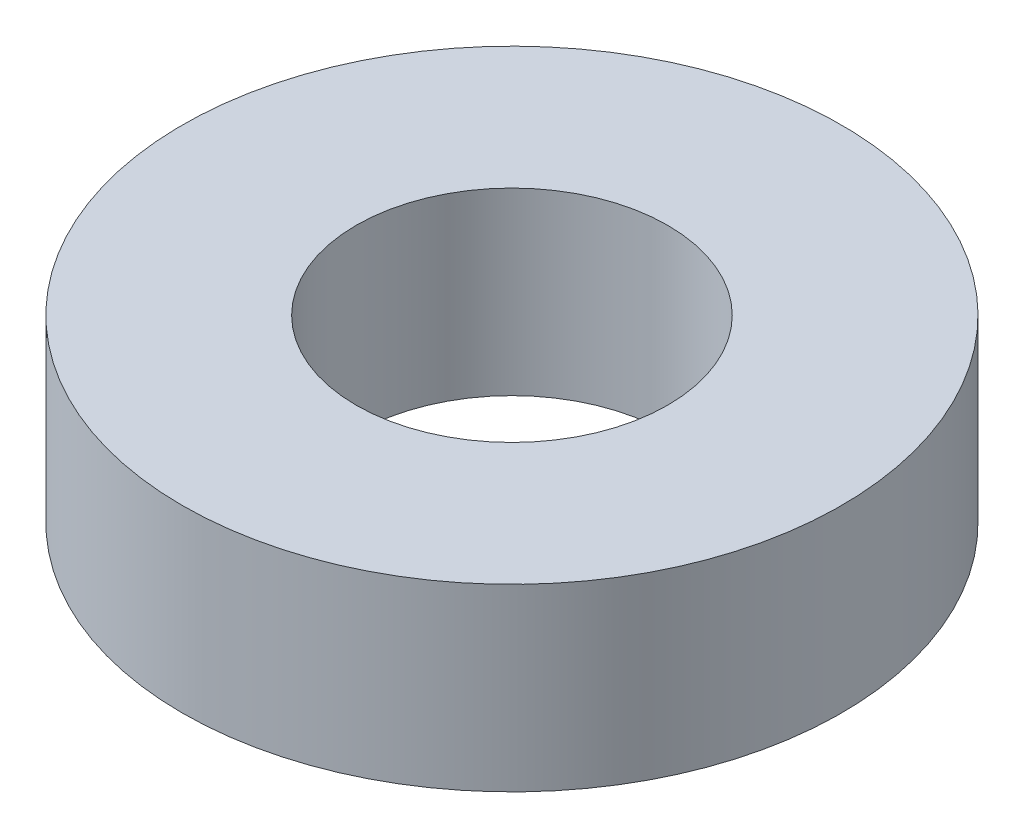
ISO-10303-21;
HEADER;
FILE_DESCRIPTION(('STEP AP214'),'2;1');
FILE_NAME('part.step','',(''),(''),'','','');
FILE_SCHEMA(('AUTOMOTIVE_DESIGN { 1 0 10303 214 1 1 1 1 }'));
ENDSEC;
DATA;
#1=APPLICATION_CONTEXT('core data for automotive mechanical design processes');
#2=APPLICATION_PROTOCOL_DEFINITION('international standard','automotive_design',2000,#1);
#3=PRODUCT_CONTEXT('',#1,'mechanical');
#4=PRODUCT('Part','Part','',(#3));
#5=PRODUCT_RELATED_PRODUCT_CATEGORY('part','',(#4));
#6=PRODUCT_DEFINITION_FORMATION('','',#4);
#7=PRODUCT_DEFINITION_CONTEXT('part definition',#1,'design');
#8=PRODUCT_DEFINITION('design','',#6,#7);
#9=PRODUCT_DEFINITION_SHAPE('','',#8);
#10=(LENGTH_UNIT() NAMED_UNIT(*) SI_UNIT(.MILLI.,.METRE.));
#11=(NAMED_UNIT(*) PLANE_ANGLE_UNIT() SI_UNIT($,.RADIAN.));
#12=(NAMED_UNIT(*) SI_UNIT($,.STERADIAN.) SOLID_ANGLE_UNIT());
#13=UNCERTAINTY_MEASURE_WITH_UNIT(LENGTH_MEASURE(1.E-05),#10,'distance_accuracy_value','');
#14=(GEOMETRIC_REPRESENTATION_CONTEXT(3) GLOBAL_UNCERTAINTY_ASSIGNED_CONTEXT((#13)) GLOBAL_UNIT_ASSIGNED_CONTEXT((#10,
#11,#12)) REPRESENTATION_CONTEXT('',''));
#15=CARTESIAN_POINT('',(0.,0.,0.));
#16=DIRECTION('',(0.,0.,1.));
#17=DIRECTION('',(1.,0.,0.));
#18=AXIS2_PLACEMENT_3D('',#15,#16,#17);
#19=CARTESIAN_POINT('',(0.,15.,0.));
#20=DIRECTION('',(0.,1.,0.));
#21=DIRECTION('',(0.,0.,1.));
#22=AXIS2_PLACEMENT_3D('',#19,#20,#21);
#23=PLANE('',#22);
#24=CARTESIAN_POINT('',(0.,15.,0.));
#25=DIRECTION('',(0.,1.,0.));
#26=DIRECTION('',(0.,0.,1.));
#27=AXIS2_PLACEMENT_3D('',#24,#25,#26);
#28=CIRCLE('',#27,27.5);
#29=CARTESIAN_POINT('',(0.,15.,27.5));
#30=VERTEX_POINT('',#29);
#31=EDGE_CURVE('E10',#30,#30,#28,.T.);
#32=ORIENTED_EDGE('',*,*,#31,.T.);
#33=EDGE_LOOP('',(#32));
#34=FACE_BOUND('',#33,.T.);
#35=CARTESIAN_POINT('',(0.,15.,0.));
#36=DIRECTION('',(0.,1.,0.));
#37=DIRECTION('',(0.,0.,1.));
#38=AXIS2_PLACEMENT_3D('',#35,#36,#37);
#39=CIRCLE('',#38,13.);
#40=CARTESIAN_POINT('',(0.,15.,13.));
#41=VERTEX_POINT('',#40);
#42=EDGE_CURVE('E26',#41,#41,#39,.T.);
#43=ORIENTED_EDGE('',*,*,#42,.F.);
#44=EDGE_LOOP('',(#43));
#45=FACE_BOUND('',#44,.T.);
#46=ADVANCED_FACE('F15',(#34,#45),#23,.T.);
#47=CARTESIAN_POINT('',(0.,0.,0.));
#48=DIRECTION('',(0.,1.,0.));
#49=DIRECTION('',(0.,0.,1.));
#50=AXIS2_PLACEMENT_3D('',#47,#48,#49);
#51=PLANE('',#50);
#52=CARTESIAN_POINT('',(0.,0.,0.));
#53=DIRECTION('',(0.,1.,0.));
#54=DIRECTION('',(0.,0.,1.));
#55=AXIS2_PLACEMENT_3D('',#52,#53,#54);
#56=CIRCLE('',#55,27.5);
#57=CARTESIAN_POINT('',(0.,0.,27.5));
#58=VERTEX_POINT('',#57);
#59=EDGE_CURVE('E19',#58,#58,#56,.T.);
#60=ORIENTED_EDGE('',*,*,#59,.F.);
#61=EDGE_LOOP('',(#60));
#62=FACE_BOUND('',#61,.T.);
#63=CARTESIAN_POINT('',(0.,0.,0.));
#64=DIRECTION('',(0.,1.,0.));
#65=DIRECTION('',(0.,0.,1.));
#66=AXIS2_PLACEMENT_3D('',#63,#64,#65);
#67=CIRCLE('',#66,13.);
#68=CARTESIAN_POINT('',(0.,0.,13.));
#69=VERTEX_POINT('',#68);
#70=EDGE_CURVE('E28',#69,#69,#67,.T.);
#71=ORIENTED_EDGE('',*,*,#70,.T.);
#72=EDGE_LOOP('',(#71));
#73=FACE_BOUND('',#72,.T.);
#74=ADVANCED_FACE('F38',(#62,#73),#51,.F.);
#75=CARTESIAN_POINT('',(0.,15.,0.));
#76=DIRECTION('',(0.,-1.,0.));
#77=DIRECTION('',(0.,0.,-1.));
#78=AXIS2_PLACEMENT_3D('',#75,#76,#77);
#79=CYLINDRICAL_SURFACE('',#78,27.5);
#80=ORIENTED_EDGE('',*,*,#31,.F.);
#81=EDGE_LOOP('',(#80));
#82=FACE_BOUND('',#81,.T.);
#83=ORIENTED_EDGE('',*,*,#59,.T.);
#84=EDGE_LOOP('',(#83));
#85=FACE_BOUND('',#84,.T.);
#86=ADVANCED_FACE('F17',(#82,#85),#79,.T.);
#87=CARTESIAN_POINT('',(0.,15.,0.));
#88=DIRECTION('',(0.,-1.,0.));
#89=DIRECTION('',(0.,0.,-1.));
#90=AXIS2_PLACEMENT_3D('',#87,#88,#89);
#91=CYLINDRICAL_SURFACE('',#90,13.);
#92=ORIENTED_EDGE('',*,*,#42,.T.);
#93=EDGE_LOOP('',(#92));
#94=FACE_BOUND('',#93,.T.);
#95=ORIENTED_EDGE('',*,*,#70,.F.);
#96=EDGE_LOOP('',(#95));
#97=FACE_BOUND('',#96,.T.);
#98=ADVANCED_FACE('F34',(#94,#97),#91,.F.);
#99=CLOSED_SHELL('',(#46,#74,#86,#98));
#100=MANIFOLD_SOLID_BREP('B1',#99);
#101=ADVANCED_BREP_SHAPE_REPRESENTATION('',(#18,#100),#14);
#102=SHAPE_DEFINITION_REPRESENTATION(#9,#101);
ENDSEC;
END-ISO-10303-21;
